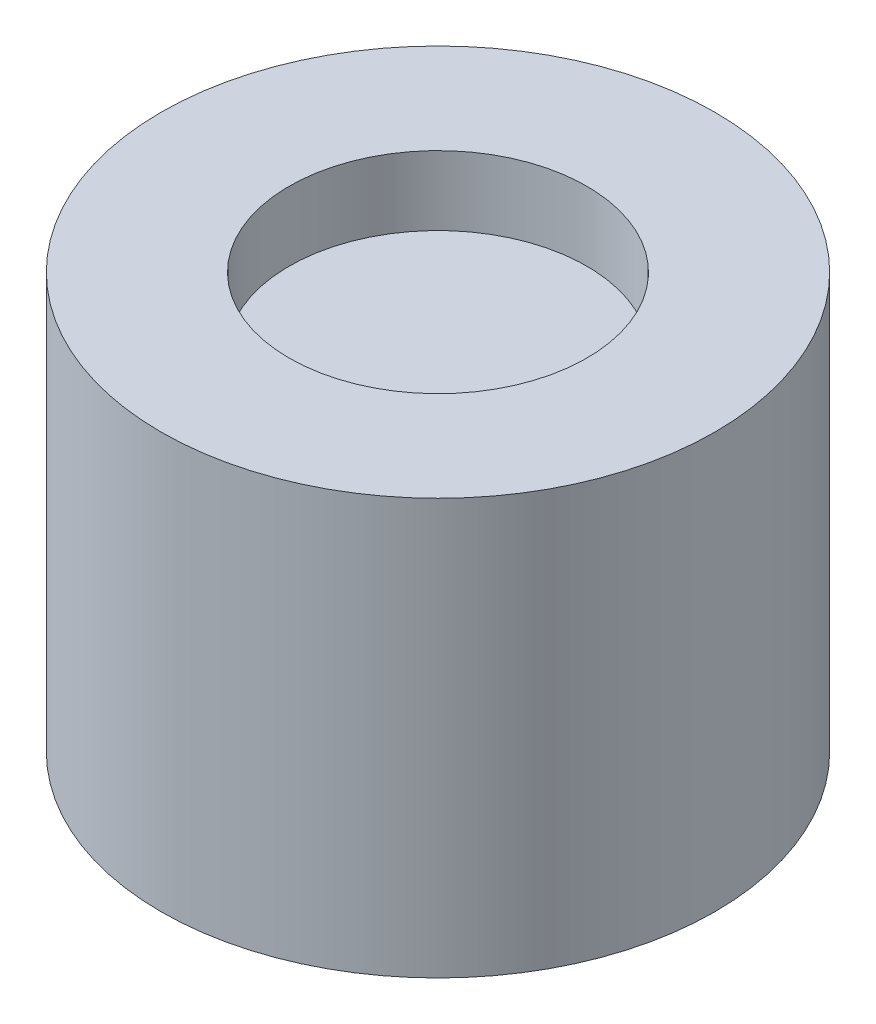
ISO-10303-21;
HEADER;
FILE_DESCRIPTION(('STEP AP214'),'2;1');
FILE_NAME('part.step','',(''),(''),'','','');
FILE_SCHEMA(('AUTOMOTIVE_DESIGN { 1 0 10303 214 1 1 1 1 }'));
ENDSEC;
DATA;
#1=APPLICATION_CONTEXT('core data for automotive mechanical design processes');
#2=APPLICATION_PROTOCOL_DEFINITION('international standard','automotive_design',2000,#1);
#3=PRODUCT_CONTEXT('',#1,'mechanical');
#4=PRODUCT('Part','Part','',(#3));
#5=PRODUCT_RELATED_PRODUCT_CATEGORY('part','',(#4));
#6=PRODUCT_DEFINITION_FORMATION('','',#4);
#7=PRODUCT_DEFINITION_CONTEXT('part definition',#1,'design');
#8=PRODUCT_DEFINITION('design','',#6,#7);
#9=PRODUCT_DEFINITION_SHAPE('','',#8);
#10=(LENGTH_UNIT() NAMED_UNIT(*) SI_UNIT(.MILLI.,.METRE.));
#11=(NAMED_UNIT(*) PLANE_ANGLE_UNIT() SI_UNIT($,.RADIAN.));
#12=(NAMED_UNIT(*) SI_UNIT($,.STERADIAN.) SOLID_ANGLE_UNIT());
#13=UNCERTAINTY_MEASURE_WITH_UNIT(LENGTH_MEASURE(1.E-05),#10,'distance_accuracy_value','');
#14=(GEOMETRIC_REPRESENTATION_CONTEXT(3) GLOBAL_UNCERTAINTY_ASSIGNED_CONTEXT((#13)) GLOBAL_UNIT_ASSIGNED_CONTEXT((#10,
#11,#12)) REPRESENTATION_CONTEXT('',''));
#15=CARTESIAN_POINT('',(0.,0.,0.));
#16=DIRECTION('',(0.,0.,1.));
#17=DIRECTION('',(1.,0.,0.));
#18=AXIS2_PLACEMENT_3D('',#15,#16,#17);
#19=CARTESIAN_POINT('',(0.,4.,0.));
#20=DIRECTION('',(0.,-1.,0.));
#21=DIRECTION('',(0.,0.,-1.));
#22=AXIS2_PLACEMENT_3D('',#19,#20,#21);
#23=CYLINDRICAL_SURFACE('',#22,1.26);
#24=CARTESIAN_POINT('',(0.,4.,0.));
#25=DIRECTION('',(0.,1.,0.));
#26=DIRECTION('',(0.,0.,1.));
#27=AXIS2_PLACEMENT_3D('',#24,#25,#26);
#28=CIRCLE('',#27,1.26);
#29=CARTESIAN_POINT('',(0.,4.,1.26));
#30=VERTEX_POINT('',#29);
#31=EDGE_CURVE('E50',#30,#30,#28,.T.);
#32=ORIENTED_EDGE('',*,*,#31,.T.);
#33=EDGE_LOOP('',(#32));
#34=FACE_BOUND('',#33,.T.);
#35=CARTESIAN_POINT('',(0.,0.,0.));
#36=DIRECTION('',(0.,1.,0.));
#37=DIRECTION('',(0.,0.,1.));
#38=AXIS2_PLACEMENT_3D('',#35,#36,#37);
#39=CIRCLE('',#38,1.26);
#40=CARTESIAN_POINT('',(0.,0.,1.26));
#41=VERTEX_POINT('',#40);
#42=EDGE_CURVE('E46',#41,#41,#39,.T.);
#43=ORIENTED_EDGE('',*,*,#42,.F.);
#44=EDGE_LOOP('',(#43));
#45=FACE_BOUND('',#44,.T.);
#46=ADVANCED_FACE('F36',(#34,#45),#23,.F.);
#47=CARTESIAN_POINT('',(0.,4.,0.));
#48=DIRECTION('',(0.,-1.,0.));
#49=DIRECTION('',(0.,0.,-1.));
#50=AXIS2_PLACEMENT_3D('',#47,#48,#49);
#51=CYLINDRICAL_SURFACE('',#50,4.);
#52=CARTESIAN_POINT('',(0.,0.,0.));
#53=DIRECTION('',(0.,1.,0.));
#54=DIRECTION('',(0.,0.,1.));
#55=AXIS2_PLACEMENT_3D('',#52,#53,#54);
#56=CIRCLE('',#55,4.);
#57=CARTESIAN_POINT('',(0.,0.,4.));
#58=VERTEX_POINT('',#57);
#59=EDGE_CURVE('E42',#58,#58,#56,.T.);
#60=ORIENTED_EDGE('',*,*,#59,.T.);
#61=EDGE_LOOP('',(#60));
#62=FACE_BOUND('',#61,.T.);
#63=CARTESIAN_POINT('',(0.,6.,0.));
#64=DIRECTION('',(0.,1.,0.));
#65=DIRECTION('',(0.,0.,1.));
#66=AXIS2_PLACEMENT_3D('',#63,#64,#65);
#67=CIRCLE('',#66,4.);
#68=CARTESIAN_POINT('',(0.,6.,4.));
#69=VERTEX_POINT('',#68);
#70=EDGE_CURVE('E55',#69,#69,#67,.T.);
#71=ORIENTED_EDGE('',*,*,#70,.F.);
#72=EDGE_LOOP('',(#71));
#73=FACE_BOUND('',#72,.T.);
#74=ADVANCED_FACE('F71',(#62,#73),#51,.T.);
#75=CARTESIAN_POINT('',(0.,0.,0.));
#76=DIRECTION('',(0.,1.,0.));
#77=DIRECTION('',(0.,0.,1.));
#78=AXIS2_PLACEMENT_3D('',#75,#76,#77);
#79=PLANE('',#78);
#80=ORIENTED_EDGE('',*,*,#42,.T.);
#81=EDGE_LOOP('',(#80));
#82=FACE_BOUND('',#81,.T.);
#83=ORIENTED_EDGE('',*,*,#59,.F.);
#84=EDGE_LOOP('',(#83));
#85=FACE_BOUND('',#84,.T.);
#86=ADVANCED_FACE('F73',(#82,#85),#79,.F.);
#87=CARTESIAN_POINT('',(0.,4.,0.));
#88=DIRECTION('',(0.,1.,0.));
#89=DIRECTION('',(0.,0.,1.));
#90=AXIS2_PLACEMENT_3D('',#87,#88,#89);
#91=PLANE('',#90);
#92=ORIENTED_EDGE('',*,*,#31,.F.);
#93=EDGE_LOOP('',(#92));
#94=FACE_BOUND('',#93,.T.);
#95=ADVANCED_FACE('F78',(#94),#91,.F.);
#96=CARTESIAN_POINT('',(0.,6.,0.));
#97=DIRECTION('',(0.,-1.,0.));
#98=DIRECTION('',(0.,0.,-1.));
#99=AXIS2_PLACEMENT_3D('',#96,#97,#98);
#100=CYLINDRICAL_SURFACE('',#99,2.15);
#101=CARTESIAN_POINT('',(0.,6.,0.));
#102=DIRECTION('',(0.,1.,0.));
#103=DIRECTION('',(0.,0.,1.));
#104=AXIS2_PLACEMENT_3D('',#101,#102,#103);
#105=CIRCLE('',#104,2.15);
#106=CARTESIAN_POINT('',(0.,6.,2.15));
#107=VERTEX_POINT('',#106);
#108=EDGE_CURVE('E58',#107,#107,#105,.T.);
#109=ORIENTED_EDGE('',*,*,#108,.T.);
#110=EDGE_LOOP('',(#109));
#111=FACE_BOUND('',#110,.T.);
#112=CARTESIAN_POINT('',(0.,5.,0.));
#113=DIRECTION('',(0.,1.,0.));
#114=DIRECTION('',(0.,0.,1.));
#115=AXIS2_PLACEMENT_3D('',#112,#113,#114);
#116=CIRCLE('',#115,2.15);
#117=CARTESIAN_POINT('',(0.,5.,2.15));
#118=VERTEX_POINT('',#117);
#119=EDGE_CURVE('E10',#118,#118,#116,.F.);
#120=ORIENTED_EDGE('',*,*,#119,.T.);
#121=EDGE_LOOP('',(#120));
#122=FACE_BOUND('',#121,.T.);
#123=ADVANCED_FACE('F62',(#111,#122),#100,.F.);
#124=CARTESIAN_POINT('',(0.,6.,0.));
#125=DIRECTION('',(0.,1.,0.));
#126=DIRECTION('',(0.,0.,1.));
#127=AXIS2_PLACEMENT_3D('',#124,#125,#126);
#128=PLANE('',#127);
#129=ORIENTED_EDGE('',*,*,#108,.F.);
#130=EDGE_LOOP('',(#129));
#131=FACE_BOUND('',#130,.T.);
#132=ORIENTED_EDGE('',*,*,#70,.T.);
#133=EDGE_LOOP('',(#132));
#134=FACE_BOUND('',#133,.T.);
#135=ADVANCED_FACE('F64',(#131,#134),#128,.T.);
#136=CARTESIAN_POINT('',(0.,5.,0.));
#137=DIRECTION('',(0.,1.,0.));
#138=DIRECTION('',(0.,0.,1.));
#139=AXIS2_PLACEMENT_3D('',#136,#137,#138);
#140=PLANE('',#139);
#141=ORIENTED_EDGE('',*,*,#119,.F.);
#142=EDGE_LOOP('',(#141));
#143=FACE_BOUND('',#142,.T.);
#144=ADVANCED_FACE('F67',(#143),#140,.T.);
#145=CLOSED_SHELL('',(#46,#74,#86,#95,#123,#135,#144));
#146=MANIFOLD_SOLID_BREP('B2',#145);
#147=ADVANCED_BREP_SHAPE_REPRESENTATION('',(#18,#146),#14);
#148=SHAPE_DEFINITION_REPRESENTATION(#9,#147);
ENDSEC;
END-ISO-10303-21;
